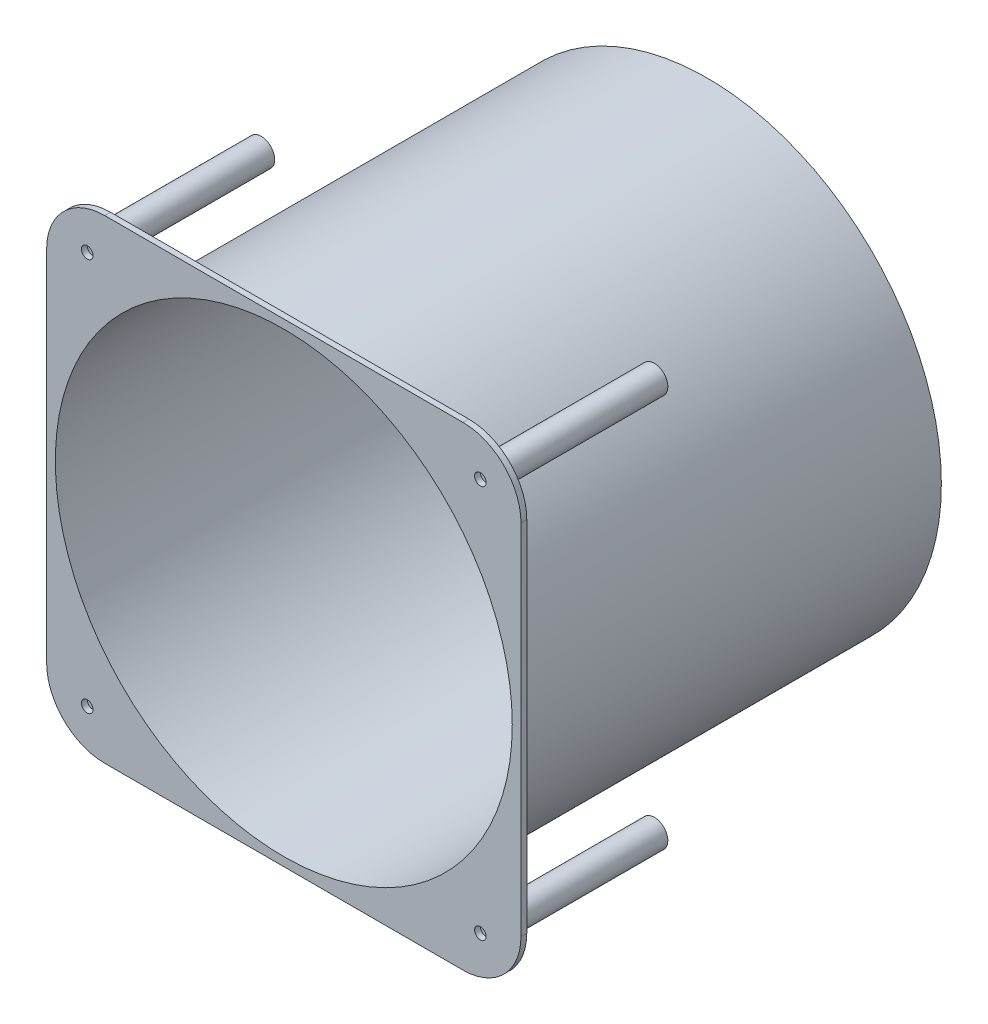
ISO-10303-21;
HEADER;
FILE_DESCRIPTION(('STEP AP214'),'2;1');
FILE_NAME('part.step','',(''),(''),'','','');
FILE_SCHEMA(('AUTOMOTIVE_DESIGN { 1 0 10303 214 1 1 1 1 }'));
ENDSEC;
DATA;
#1=APPLICATION_CONTEXT('core data for automotive mechanical design processes');
#2=APPLICATION_PROTOCOL_DEFINITION('international standard','automotive_design',2000,#1);
#3=PRODUCT_CONTEXT('',#1,'mechanical');
#4=PRODUCT('Part','Part','',(#3));
#5=PRODUCT_RELATED_PRODUCT_CATEGORY('part','',(#4));
#6=PRODUCT_DEFINITION_FORMATION('','',#4);
#7=PRODUCT_DEFINITION_CONTEXT('part definition',#1,'design');
#8=PRODUCT_DEFINITION('design','',#6,#7);
#9=PRODUCT_DEFINITION_SHAPE('','',#8);
#10=(LENGTH_UNIT() NAMED_UNIT(*) SI_UNIT(.MILLI.,.METRE.));
#11=(NAMED_UNIT(*) PLANE_ANGLE_UNIT() SI_UNIT($,.RADIAN.));
#12=(NAMED_UNIT(*) SI_UNIT($,.STERADIAN.) SOLID_ANGLE_UNIT());
#13=UNCERTAINTY_MEASURE_WITH_UNIT(LENGTH_MEASURE(1.E-05),#10,'distance_accuracy_value','');
#14=(GEOMETRIC_REPRESENTATION_CONTEXT(3) GLOBAL_UNCERTAINTY_ASSIGNED_CONTEXT((#13)) GLOBAL_UNIT_ASSIGNED_CONTEXT((#10,
#11,#12)) REPRESENTATION_CONTEXT('',''));
#15=CARTESIAN_POINT('',(0.,0.,0.));
#16=DIRECTION('',(0.,0.,1.));
#17=DIRECTION('',(1.,0.,0.));
#18=AXIS2_PLACEMENT_3D('',#15,#16,#17);
#19=CARTESIAN_POINT('',(0.,0.,-92.71));
#20=DIRECTION('',(0.,0.,1.));
#21=DIRECTION('',(1.,0.,0.));
#22=AXIS2_PLACEMENT_3D('',#19,#20,#21);
#23=CYLINDRICAL_SURFACE('',#22,51.308);
#24=CARTESIAN_POINT('',(0.,0.,-1.26999999999999));
#25=DIRECTION('',(0.,0.,-1.));
#26=DIRECTION('',(-1.,0.,0.));
#27=AXIS2_PLACEMENT_3D('',#24,#25,#26);
#28=CIRCLE('',#27,51.308);
#29=CARTESIAN_POINT('',(51.308,0.,-1.26999999999999));
#30=VERTEX_POINT('',#29);
#31=EDGE_CURVE('E130',#30,#30,#28,.F.);
#32=CARTESIAN_POINT('',(0.,0.,-92.71));
#33=DIRECTION('',(0.,0.,1.));
#34=DIRECTION('',(1.,0.,0.));
#35=AXIS2_PLACEMENT_3D('',#32,#33,#34);
#36=CIRCLE('',#35,51.308);
#37=CARTESIAN_POINT('',(51.308,0.,-92.71));
#38=VERTEX_POINT('',#37);
#39=EDGE_CURVE('E135',#38,#38,#36,.T.);
#40=CARTESIAN_POINT('',(51.308,0.,-1.26999999999999));
#41=CARTESIAN_POINT('',(51.308,0.,-2.22249999999999));
#42=CARTESIAN_POINT('',(51.308,0.,-3.17499999999999));
#43=CARTESIAN_POINT('',(51.308,0.,-5.07999999999999));
#44=CARTESIAN_POINT('',(51.308,0.,-6.03249999999999));
#45=CARTESIAN_POINT('',(51.308,0.,-7.93749999999999));
#46=CARTESIAN_POINT('',(51.308,0.,-8.89));
#47=CARTESIAN_POINT('',(51.308,0.,-10.795));
#48=CARTESIAN_POINT('',(51.308,0.,-11.7475));
#49=CARTESIAN_POINT('',(51.308,0.,-13.6525));
#50=CARTESIAN_POINT('',(51.308,0.,-14.605));
#51=CARTESIAN_POINT('',(51.308,0.,-16.51));
#52=CARTESIAN_POINT('',(51.308,0.,-17.4625));
#53=CARTESIAN_POINT('',(51.308,0.,-19.3675));
#54=CARTESIAN_POINT('',(51.308,0.,-20.32));
#55=CARTESIAN_POINT('',(51.308,0.,-22.225));
#56=CARTESIAN_POINT('',(51.308,0.,-23.1775));
#57=CARTESIAN_POINT('',(51.308,0.,-25.0825));
#58=CARTESIAN_POINT('',(51.308,0.,-26.035));
#59=CARTESIAN_POINT('',(51.308,0.,-27.94));
#60=CARTESIAN_POINT('',(51.308,0.,-28.8925));
#61=CARTESIAN_POINT('',(51.308,0.,-30.7975));
#62=CARTESIAN_POINT('',(51.308,0.,-31.75));
#63=CARTESIAN_POINT('',(51.308,0.,-33.655));
#64=CARTESIAN_POINT('',(51.308,0.,-34.6075));
#65=CARTESIAN_POINT('',(51.308,0.,-36.5125));
#66=CARTESIAN_POINT('',(51.308,0.,-37.465));
#67=CARTESIAN_POINT('',(51.308,0.,-39.37));
#68=CARTESIAN_POINT('',(51.308,0.,-40.3225));
#69=CARTESIAN_POINT('',(51.308,0.,-42.2275));
#70=CARTESIAN_POINT('',(51.308,0.,-43.18));
#71=CARTESIAN_POINT('',(51.308,0.,-45.085));
#72=CARTESIAN_POINT('',(51.308,0.,-46.0375));
#73=CARTESIAN_POINT('',(51.308,0.,-47.9425));
#74=CARTESIAN_POINT('',(51.308,0.,-48.895));
#75=CARTESIAN_POINT('',(51.308,0.,-50.8));
#76=CARTESIAN_POINT('',(51.308,0.,-51.7525));
#77=CARTESIAN_POINT('',(51.308,0.,-53.6575));
#78=CARTESIAN_POINT('',(51.308,0.,-54.61));
#79=CARTESIAN_POINT('',(51.308,0.,-56.515));
#80=CARTESIAN_POINT('',(51.308,0.,-57.4675));
#81=CARTESIAN_POINT('',(51.308,0.,-59.3725));
#82=CARTESIAN_POINT('',(51.308,0.,-60.325));
#83=CARTESIAN_POINT('',(51.308,0.,-62.23));
#84=CARTESIAN_POINT('',(51.308,0.,-63.1825));
#85=CARTESIAN_POINT('',(51.308,0.,-65.0875));
#86=CARTESIAN_POINT('',(51.308,0.,-66.04));
#87=CARTESIAN_POINT('',(51.308,0.,-67.945));
#88=CARTESIAN_POINT('',(51.308,0.,-68.8975));
#89=CARTESIAN_POINT('',(51.308,0.,-70.8025));
#90=CARTESIAN_POINT('',(51.308,0.,-71.755));
#91=CARTESIAN_POINT('',(51.308,0.,-73.66));
#92=CARTESIAN_POINT('',(51.308,0.,-74.6125));
#93=CARTESIAN_POINT('',(51.308,0.,-76.5175));
#94=CARTESIAN_POINT('',(51.308,0.,-77.47));
#95=CARTESIAN_POINT('',(51.308,0.,-79.375));
#96=CARTESIAN_POINT('',(51.308,0.,-80.3275));
#97=CARTESIAN_POINT('',(51.308,0.,-82.2325));
#98=CARTESIAN_POINT('',(51.308,0.,-83.185));
#99=CARTESIAN_POINT('',(51.308,0.,-85.09));
#100=CARTESIAN_POINT('',(51.308,0.,-86.0425));
#101=CARTESIAN_POINT('',(51.308,0.,-87.9475));
#102=CARTESIAN_POINT('',(51.308,0.,-88.9));
#103=CARTESIAN_POINT('',(51.308,0.,-90.805));
#104=CARTESIAN_POINT('',(51.308,0.,-91.7575));
#105=CARTESIAN_POINT('',(51.308,0.,-92.71));
#106=B_SPLINE_CURVE_WITH_KNOTS('',3,(#40,#41,#42,#43,#44,#45,#46,#47,#48,#49,#50,#51,#52,#53,
#54,#55,#56,#57,#58,#59,#60,#61,#62,#63,#64,#65,#66,#67,#68,#69,#70,#71,#72,#73,#74,#75,#76,#77,
#78,#79,#80,#81,#82,#83,#84,#85,#86,#87,#88,#89,#90,#91,#92,#93,#94,#95,#96,#97,#98,#99,#100,
#101,#102,#103,#104,#105),.UNSPECIFIED.,.F.,.F.,(4,2,2,2,2,2,2,2,2,2,2,2,2,2,2,2,2,2,2,2,2,2,2,
2,2,2,2,2,2,2,2,2,4),(0.,2.8575,5.715,8.57250000000001,11.43,14.2875,17.145,20.0025,22.86,
25.7175,28.575,31.4325,34.29,37.1475,40.005,42.8625,45.72,48.5775,51.435,54.2925,57.15,60.0075,
62.865,65.7225,68.58,71.4375,74.295,77.1525,80.01,82.8675,85.725,88.5825,91.44),.UNSPECIFIED.);
#107=EDGE_CURVE('BSEAM38',#30,#38,#106,.T.);
#108=ORIENTED_EDGE('',*,*,#31,.F.);
#109=ORIENTED_EDGE('',*,*,#39,.T.);
#110=ORIENTED_EDGE('',*,*,#107,.T.);
#111=ORIENTED_EDGE('',*,*,#107,.F.);
#112=EDGE_LOOP('',(#108,#110,#109,#111));
#113=FACE_BOUND('',#112,.T.);
#114=ADVANCED_FACE('F38',(#113),#23,.T.);
#115=CARTESIAN_POINT('',(0.,0.,-92.71));
#116=DIRECTION('',(0.,0.,1.));
#117=DIRECTION('',(1.,0.,0.));
#118=AXIS2_PLACEMENT_3D('',#115,#116,#117);
#119=PLANE('',#118);
#120=CARTESIAN_POINT('',(0.,0.,-92.71));
#121=DIRECTION('',(0.,0.,1.));
#122=DIRECTION('',(1.,0.,0.));
#123=AXIS2_PLACEMENT_3D('',#120,#121,#122);
#124=CIRCLE('',#123,50.038);
#125=CARTESIAN_POINT('',(50.038,0.,-92.71));
#126=VERTEX_POINT('',#125);
#127=EDGE_CURVE('E247',#126,#126,#124,.T.);
#128=ORIENTED_EDGE('',*,*,#127,.T.);
#129=EDGE_LOOP('',(#128));
#130=FACE_BOUND('',#129,.T.);
#131=ORIENTED_EDGE('',*,*,#39,.F.);
#132=EDGE_LOOP('',(#131));
#133=FACE_BOUND('',#132,.T.);
#134=ADVANCED_FACE('F179',(#130,#133),#119,.F.);
#135=CARTESIAN_POINT('',(51.943,-51.943,-1.27));
#136=DIRECTION('',(1.,0.,0.));
#137=DIRECTION('',(0.,0.,-1.));
#138=AXIS2_PLACEMENT_3D('',#135,#136,#137);
#139=PLANE('',#138);
#140=DIRECTION('',(0.,1.,0.));
#141=VECTOR('',#140,1.);
#142=CARTESIAN_POINT('',(51.943,-51.943,0.));
#143=LINE('',#142,#141);
#144=CARTESIAN_POINT('',(51.943,-39.243,0.));
#145=VERTEX_POINT('',#144);
#146=CARTESIAN_POINT('',(51.943,39.243,0.));
#147=VERTEX_POINT('',#146);
#148=EDGE_CURVE('E168',#145,#147,#143,.T.);
#149=ORIENTED_EDGE('',*,*,#148,.F.);
#150=DIRECTION('',(0.,0.,1.));
#151=VECTOR('',#150,1.);
#152=CARTESIAN_POINT('',(51.943,-39.243,-1.27));
#153=LINE('',#152,#151);
#154=CARTESIAN_POINT('',(51.943,-39.243,-1.27));
#155=VERTEX_POINT('',#154);
#156=EDGE_CURVE('E145',#145,#155,#153,.F.);
#157=ORIENTED_EDGE('',*,*,#156,.T.);
#158=DIRECTION('',(0.,1.,0.));
#159=VECTOR('',#158,1.);
#160=CARTESIAN_POINT('',(51.943,-51.943,-1.27));
#161=LINE('',#160,#159);
#162=CARTESIAN_POINT('',(51.943,39.243,-1.27));
#163=VERTEX_POINT('',#162);
#164=EDGE_CURVE('E125',#155,#163,#161,.T.);
#165=ORIENTED_EDGE('',*,*,#164,.T.);
#166=DIRECTION('',(0.,0.,1.));
#167=VECTOR('',#166,1.);
#168=CARTESIAN_POINT('',(51.943,39.243,-1.27));
#169=LINE('',#168,#167);
#170=EDGE_CURVE('E142',#163,#147,#169,.T.);
#171=ORIENTED_EDGE('',*,*,#170,.T.);
#172=EDGE_LOOP('',(#149,#157,#165,#171));
#173=FACE_BOUND('',#172,.T.);
#174=ADVANCED_FACE('F181',(#173),#139,.T.);
#175=CARTESIAN_POINT('',(-51.943,-51.943,-1.27));
#176=DIRECTION('',(0.,-1.,0.));
#177=DIRECTION('',(0.,0.,-1.));
#178=AXIS2_PLACEMENT_3D('',#175,#176,#177);
#179=PLANE('',#178);
#180=DIRECTION('',(1.,0.,0.));
#181=VECTOR('',#180,1.);
#182=CARTESIAN_POINT('',(-51.943,-51.943,-1.27));
#183=LINE('',#182,#181);
#184=CARTESIAN_POINT('',(-39.243,-51.943,-1.27));
#185=VERTEX_POINT('',#184);
#186=CARTESIAN_POINT('',(39.243,-51.943,-1.27));
#187=VERTEX_POINT('',#186);
#188=EDGE_CURVE('E161',#185,#187,#183,.T.);
#189=ORIENTED_EDGE('',*,*,#188,.T.);
#190=DIRECTION('',(0.,0.,1.));
#191=VECTOR('',#190,1.);
#192=CARTESIAN_POINT('',(39.243,-51.943,-1.27));
#193=LINE('',#192,#191);
#194=CARTESIAN_POINT('',(39.243,-51.943,0.));
#195=VERTEX_POINT('',#194);
#196=EDGE_CURVE('E124',#187,#195,#193,.T.);
#197=ORIENTED_EDGE('',*,*,#196,.T.);
#198=DIRECTION('',(1.,0.,0.));
#199=VECTOR('',#198,1.);
#200=CARTESIAN_POINT('',(-51.943,-51.943,0.));
#201=LINE('',#200,#199);
#202=CARTESIAN_POINT('',(-39.243,-51.943,0.));
#203=VERTEX_POINT('',#202);
#204=EDGE_CURVE('E107',#203,#195,#201,.T.);
#205=ORIENTED_EDGE('',*,*,#204,.F.);
#206=DIRECTION('',(0.,0.,1.));
#207=VECTOR('',#206,1.);
#208=CARTESIAN_POINT('',(-39.243,-51.943,-1.27));
#209=LINE('',#208,#207);
#210=EDGE_CURVE('E121',#203,#185,#209,.F.);
#211=ORIENTED_EDGE('',*,*,#210,.T.);
#212=EDGE_LOOP('',(#189,#197,#205,#211));
#213=FACE_BOUND('',#212,.T.);
#214=ADVANCED_FACE('F120',(#213),#179,.T.);
#215=CARTESIAN_POINT('',(-51.943,-51.943,-1.27));
#216=DIRECTION('',(-1.,0.,0.));
#217=DIRECTION('',(0.,0.,1.));
#218=AXIS2_PLACEMENT_3D('',#215,#216,#217);
#219=PLANE('',#218);
#220=DIRECTION('',(0.,-1.,0.));
#221=VECTOR('',#220,1.);
#222=CARTESIAN_POINT('',(-51.943,-51.943,-1.27));
#223=LINE('',#222,#221);
#224=CARTESIAN_POINT('',(-51.943,39.243,-1.27));
#225=VERTEX_POINT('',#224);
#226=CARTESIAN_POINT('',(-51.943,-39.243,-1.27));
#227=VERTEX_POINT('',#226);
#228=EDGE_CURVE('E160',#225,#227,#223,.T.);
#229=ORIENTED_EDGE('',*,*,#228,.T.);
#230=DIRECTION('',(0.,0.,1.));
#231=VECTOR('',#230,1.);
#232=CARTESIAN_POINT('',(-51.943,-39.243,-1.27));
#233=LINE('',#232,#231);
#234=CARTESIAN_POINT('',(-51.943,-39.243,0.));
#235=VERTEX_POINT('',#234);
#236=EDGE_CURVE('E155',#227,#235,#233,.T.);
#237=ORIENTED_EDGE('',*,*,#236,.T.);
#238=DIRECTION('',(0.,-1.,0.));
#239=VECTOR('',#238,1.);
#240=CARTESIAN_POINT('',(-51.943,-51.943,0.));
#241=LINE('',#240,#239);
#242=CARTESIAN_POINT('',(-51.943,39.243,0.));
#243=VERTEX_POINT('',#242);
#244=EDGE_CURVE('E109',#243,#235,#241,.T.);
#245=ORIENTED_EDGE('',*,*,#244,.F.);
#246=DIRECTION('',(0.,0.,1.));
#247=VECTOR('',#246,1.);
#248=CARTESIAN_POINT('',(-51.943,39.243,-1.27));
#249=LINE('',#248,#247);
#250=EDGE_CURVE('E153',#243,#225,#249,.F.);
#251=ORIENTED_EDGE('',*,*,#250,.T.);
#252=EDGE_LOOP('',(#229,#237,#245,#251));
#253=FACE_BOUND('',#252,.T.);
#254=ADVANCED_FACE('F158',(#253),#219,.T.);
#255=CARTESIAN_POINT('',(-51.943,51.943,-1.27));
#256=DIRECTION('',(0.,1.,0.));
#257=DIRECTION('',(0.,0.,1.));
#258=AXIS2_PLACEMENT_3D('',#255,#256,#257);
#259=PLANE('',#258);
#260=DIRECTION('',(-1.,0.,0.));
#261=VECTOR('',#260,1.);
#262=CARTESIAN_POINT('',(-51.943,51.943,-1.27));
#263=LINE('',#262,#261);
#264=CARTESIAN_POINT('',(39.243,51.943,-1.27));
#265=VERTEX_POINT('',#264);
#266=CARTESIAN_POINT('',(-39.243,51.943,-1.27));
#267=VERTEX_POINT('',#266);
#268=EDGE_CURVE('E162',#265,#267,#263,.T.);
#269=ORIENTED_EDGE('',*,*,#268,.T.);
#270=DIRECTION('',(0.,0.,1.));
#271=VECTOR('',#270,1.);
#272=CARTESIAN_POINT('',(-39.243,51.943,-1.27));
#273=LINE('',#272,#271);
#274=CARTESIAN_POINT('',(-39.243,51.943,0.));
#275=VERTEX_POINT('',#274);
#276=EDGE_CURVE('E11',#267,#275,#273,.T.);
#277=ORIENTED_EDGE('',*,*,#276,.T.);
#278=DIRECTION('',(-1.,0.,0.));
#279=VECTOR('',#278,1.);
#280=CARTESIAN_POINT('',(-51.943,51.943,0.));
#281=LINE('',#280,#279);
#282=CARTESIAN_POINT('',(39.243,51.943,0.));
#283=VERTEX_POINT('',#282);
#284=EDGE_CURVE('E171',#283,#275,#281,.T.);
#285=ORIENTED_EDGE('',*,*,#284,.F.);
#286=DIRECTION('',(0.,0.,1.));
#287=VECTOR('',#286,1.);
#288=CARTESIAN_POINT('',(39.243,51.943,-1.27));
#289=LINE('',#288,#287);
#290=EDGE_CURVE('E46',#283,#265,#289,.F.);
#291=ORIENTED_EDGE('',*,*,#290,.T.);
#292=EDGE_LOOP('',(#269,#277,#285,#291));
#293=FACE_BOUND('',#292,.T.);
#294=ADVANCED_FACE('F214',(#293),#259,.T.);
#295=CARTESIAN_POINT('',(0.,0.,-1.27));
#296=DIRECTION('',(0.,0.,-1.));
#297=DIRECTION('',(-1.,0.,0.));
#298=AXIS2_PLACEMENT_3D('',#295,#296,#297);
#299=PLANE('',#298);
#300=CARTESIAN_POINT('',(43.053,-43.053,-1.27));
#301=DIRECTION('',(0.,0.,-1.));
#302=DIRECTION('',(-1.,0.,0.));
#303=AXIS2_PLACEMENT_3D('',#300,#301,#302);
#304=CIRCLE('',#303,2.9591);
#305=CARTESIAN_POINT('',(40.0939,-43.053,-1.27));
#306=VERTEX_POINT('',#305);
#307=EDGE_CURVE('E270',#306,#306,#304,.T.);
#308=ORIENTED_EDGE('',*,*,#307,.F.);
#309=EDGE_LOOP('',(#308));
#310=FACE_BOUND('',#309,.T.);
#311=CARTESIAN_POINT('',(-43.053,-43.053,-1.27));
#312=DIRECTION('',(0.,0.,-1.));
#313=DIRECTION('',(-1.,0.,0.));
#314=AXIS2_PLACEMENT_3D('',#311,#312,#313);
#315=CIRCLE('',#314,2.9591);
#316=CARTESIAN_POINT('',(-46.0121,-43.053,-1.27));
#317=VERTEX_POINT('',#316);
#318=EDGE_CURVE('E264',#317,#317,#315,.T.);
#319=ORIENTED_EDGE('',*,*,#318,.F.);
#320=EDGE_LOOP('',(#319));
#321=FACE_BOUND('',#320,.T.);
#322=CARTESIAN_POINT('',(-43.053,43.053,-1.27));
#323=DIRECTION('',(0.,0.,-1.));
#324=DIRECTION('',(-1.,0.,0.));
#325=AXIS2_PLACEMENT_3D('',#322,#323,#324);
#326=CIRCLE('',#325,2.9591);
#327=CARTESIAN_POINT('',(-46.0121,43.053,-1.27));
#328=VERTEX_POINT('',#327);
#329=EDGE_CURVE('E258',#328,#328,#326,.T.);
#330=ORIENTED_EDGE('',*,*,#329,.F.);
#331=EDGE_LOOP('',(#330));
#332=FACE_BOUND('',#331,.T.);
#333=CARTESIAN_POINT('',(43.053,43.053,-1.27));
#334=DIRECTION('',(0.,0.,-1.));
#335=DIRECTION('',(-1.,0.,0.));
#336=AXIS2_PLACEMENT_3D('',#333,#334,#335);
#337=CIRCLE('',#336,2.9591);
#338=CARTESIAN_POINT('',(40.0939,43.053,-1.27));
#339=VERTEX_POINT('',#338);
#340=EDGE_CURVE('E252',#339,#339,#337,.T.);
#341=ORIENTED_EDGE('',*,*,#340,.F.);
#342=EDGE_LOOP('',(#341));
#343=FACE_BOUND('',#342,.T.);
#344=ORIENTED_EDGE('',*,*,#31,.T.);
#345=EDGE_LOOP('',(#344));
#346=FACE_BOUND('',#345,.T.);
#347=ORIENTED_EDGE('',*,*,#164,.F.);
#348=CARTESIAN_POINT('',(39.243,-39.243,-1.27));
#349=DIRECTION('',(0.,0.,-1.));
#350=DIRECTION('',(-1.,0.,0.));
#351=AXIS2_PLACEMENT_3D('',#348,#349,#350);
#352=CIRCLE('',#351,12.7);
#353=EDGE_CURVE('E151',#155,#187,#352,.T.);
#354=ORIENTED_EDGE('',*,*,#353,.T.);
#355=ORIENTED_EDGE('',*,*,#188,.F.);
#356=CARTESIAN_POINT('',(-39.243,-39.243,-1.27));
#357=DIRECTION('',(0.,0.,-1.));
#358=DIRECTION('',(-1.,0.,0.));
#359=AXIS2_PLACEMENT_3D('',#356,#357,#358);
#360=CIRCLE('',#359,12.7);
#361=EDGE_CURVE('E129',#185,#227,#360,.T.);
#362=ORIENTED_EDGE('',*,*,#361,.T.);
#363=ORIENTED_EDGE('',*,*,#228,.F.);
#364=CARTESIAN_POINT('',(-39.243,39.243,-1.27));
#365=DIRECTION('',(0.,0.,-1.));
#366=DIRECTION('',(-1.,0.,0.));
#367=AXIS2_PLACEMENT_3D('',#364,#365,#366);
#368=CIRCLE('',#367,12.7);
#369=EDGE_CURVE('E53',#225,#267,#368,.T.);
#370=ORIENTED_EDGE('',*,*,#369,.T.);
#371=ORIENTED_EDGE('',*,*,#268,.F.);
#372=CARTESIAN_POINT('',(39.243,39.243,-1.27));
#373=DIRECTION('',(0.,0.,-1.));
#374=DIRECTION('',(-1.,0.,0.));
#375=AXIS2_PLACEMENT_3D('',#372,#373,#374);
#376=CIRCLE('',#375,12.7);
#377=EDGE_CURVE('E147',#265,#163,#376,.T.);
#378=ORIENTED_EDGE('',*,*,#377,.T.);
#379=EDGE_LOOP('',(#347,#354,#355,#362,#363,#370,#371,#378));
#380=FACE_BOUND('',#379,.T.);
#381=ADVANCED_FACE('F285',(#310,#321,#332,#343,#346,#380),#299,.T.);
#382=CARTESIAN_POINT('',(43.053,43.053,-1.27));
#383=DIRECTION('',(0.,0.,1.));
#384=DIRECTION('',(1.,0.,0.));
#385=AXIS2_PLACEMENT_3D('',#382,#383,#384);
#386=CYLINDRICAL_SURFACE('',#385,1.27);
#387=CARTESIAN_POINT('',(43.053,43.053,-1.27));
#388=DIRECTION('',(0.,0.,1.));
#389=DIRECTION('',(1.,0.,0.));
#390=AXIS2_PLACEMENT_3D('',#387,#388,#389);
#391=CIRCLE('',#390,1.27);
#392=CARTESIAN_POINT('',(44.323,43.053,-1.27));
#393=VERTEX_POINT('',#392);
#394=EDGE_CURVE('E172',#393,#393,#391,.T.);
#395=ORIENTED_EDGE('',*,*,#394,.F.);
#396=EDGE_LOOP('',(#395));
#397=FACE_BOUND('',#396,.T.);
#398=CARTESIAN_POINT('',(43.053,43.053,0.));
#399=DIRECTION('',(0.,0.,1.));
#400=DIRECTION('',(1.,0.,0.));
#401=AXIS2_PLACEMENT_3D('',#398,#399,#400);
#402=CIRCLE('',#401,1.27);
#403=CARTESIAN_POINT('',(44.323,43.053,0.));
#404=VERTEX_POINT('',#403);
#405=EDGE_CURVE('E223',#404,#404,#402,.T.);
#406=ORIENTED_EDGE('',*,*,#405,.T.);
#407=EDGE_LOOP('',(#406));
#408=FACE_BOUND('',#407,.T.);
#409=ADVANCED_FACE('F288',(#397,#408),#386,.F.);
#410=CARTESIAN_POINT('',(-43.053,43.053,-1.27));
#411=DIRECTION('',(0.,0.,1.));
#412=DIRECTION('',(1.,0.,0.));
#413=AXIS2_PLACEMENT_3D('',#410,#411,#412);
#414=CYLINDRICAL_SURFACE('',#413,1.27);
#415=CARTESIAN_POINT('',(-43.053,43.053,-1.27));
#416=DIRECTION('',(0.,0.,1.));
#417=DIRECTION('',(1.,0.,0.));
#418=AXIS2_PLACEMENT_3D('',#415,#416,#417);
#419=CIRCLE('',#418,1.27);
#420=CARTESIAN_POINT('',(-41.783,43.053,-1.27));
#421=VERTEX_POINT('',#420);
#422=EDGE_CURVE('E226',#421,#421,#419,.T.);
#423=ORIENTED_EDGE('',*,*,#422,.F.);
#424=EDGE_LOOP('',(#423));
#425=FACE_BOUND('',#424,.T.);
#426=CARTESIAN_POINT('',(-43.053,43.053,0.));
#427=DIRECTION('',(0.,0.,1.));
#428=DIRECTION('',(1.,0.,0.));
#429=AXIS2_PLACEMENT_3D('',#426,#427,#428);
#430=CIRCLE('',#429,1.27);
#431=CARTESIAN_POINT('',(-41.783,43.053,0.));
#432=VERTEX_POINT('',#431);
#433=EDGE_CURVE('E229',#432,#432,#430,.T.);
#434=ORIENTED_EDGE('',*,*,#433,.T.);
#435=EDGE_LOOP('',(#434));
#436=FACE_BOUND('',#435,.T.);
#437=ADVANCED_FACE('F323',(#425,#436),#414,.F.);
#438=CARTESIAN_POINT('',(43.053,-43.053,-1.27));
#439=DIRECTION('',(0.,0.,1.));
#440=DIRECTION('',(1.,0.,0.));
#441=AXIS2_PLACEMENT_3D('',#438,#439,#440);
#442=CYLINDRICAL_SURFACE('',#441,1.27);
#443=CARTESIAN_POINT('',(43.053,-43.053,-1.27));
#444=DIRECTION('',(0.,0.,1.));
#445=DIRECTION('',(1.,0.,0.));
#446=AXIS2_PLACEMENT_3D('',#443,#444,#445);
#447=CIRCLE('',#446,1.27);
#448=CARTESIAN_POINT('',(44.323,-43.053,-1.27));
#449=VERTEX_POINT('',#448);
#450=EDGE_CURVE('E232',#449,#449,#447,.T.);
#451=ORIENTED_EDGE('',*,*,#450,.F.);
#452=EDGE_LOOP('',(#451));
#453=FACE_BOUND('',#452,.T.);
#454=CARTESIAN_POINT('',(43.053,-43.053,0.));
#455=DIRECTION('',(0.,0.,1.));
#456=DIRECTION('',(1.,0.,0.));
#457=AXIS2_PLACEMENT_3D('',#454,#455,#456);
#458=CIRCLE('',#457,1.27);
#459=CARTESIAN_POINT('',(44.323,-43.053,0.));
#460=VERTEX_POINT('',#459);
#461=EDGE_CURVE('E235',#460,#460,#458,.T.);
#462=ORIENTED_EDGE('',*,*,#461,.T.);
#463=EDGE_LOOP('',(#462));
#464=FACE_BOUND('',#463,.T.);
#465=ADVANCED_FACE('F319',(#453,#464),#442,.F.);
#466=CARTESIAN_POINT('',(-43.053,-43.053,-1.27));
#467=DIRECTION('',(0.,0.,1.));
#468=DIRECTION('',(1.,0.,0.));
#469=AXIS2_PLACEMENT_3D('',#466,#467,#468);
#470=CYLINDRICAL_SURFACE('',#469,1.27);
#471=CARTESIAN_POINT('',(-43.053,-43.053,-1.27));
#472=DIRECTION('',(0.,0.,1.));
#473=DIRECTION('',(1.,0.,0.));
#474=AXIS2_PLACEMENT_3D('',#471,#472,#473);
#475=CIRCLE('',#474,1.27);
#476=CARTESIAN_POINT('',(-41.783,-43.053,-1.27));
#477=VERTEX_POINT('',#476);
#478=EDGE_CURVE('E238',#477,#477,#475,.T.);
#479=ORIENTED_EDGE('',*,*,#478,.F.);
#480=EDGE_LOOP('',(#479));
#481=FACE_BOUND('',#480,.T.);
#482=CARTESIAN_POINT('',(-43.053,-43.053,0.));
#483=DIRECTION('',(0.,0.,1.));
#484=DIRECTION('',(1.,0.,0.));
#485=AXIS2_PLACEMENT_3D('',#482,#483,#484);
#486=CIRCLE('',#485,1.27);
#487=CARTESIAN_POINT('',(-41.783,-43.053,0.));
#488=VERTEX_POINT('',#487);
#489=EDGE_CURVE('E241',#488,#488,#486,.T.);
#490=ORIENTED_EDGE('',*,*,#489,.T.);
#491=EDGE_LOOP('',(#490));
#492=FACE_BOUND('',#491,.T.);
#493=ADVANCED_FACE('F197',(#481,#492),#470,.F.);
#494=CARTESIAN_POINT('',(0.,0.,0.));
#495=DIRECTION('',(0.,0.,1.));
#496=DIRECTION('',(1.,0.,0.));
#497=AXIS2_PLACEMENT_3D('',#494,#495,#496);
#498=PLANE('',#497);
#499=CARTESIAN_POINT('',(0.,0.,0.));
#500=DIRECTION('',(0.,0.,-1.));
#501=DIRECTION('',(-1.,0.,0.));
#502=AXIS2_PLACEMENT_3D('',#499,#500,#501);
#503=CIRCLE('',#502,50.038);
#504=CARTESIAN_POINT('',(50.038,0.,0.));
#505=VERTEX_POINT('',#504);
#506=EDGE_CURVE('E244',#505,#505,#503,.F.);
#507=ORIENTED_EDGE('',*,*,#506,.F.);
#508=EDGE_LOOP('',(#507));
#509=FACE_BOUND('',#508,.T.);
#510=ORIENTED_EDGE('',*,*,#489,.F.);
#511=EDGE_LOOP('',(#510));
#512=FACE_BOUND('',#511,.T.);
#513=ORIENTED_EDGE('',*,*,#461,.F.);
#514=EDGE_LOOP('',(#513));
#515=FACE_BOUND('',#514,.T.);
#516=ORIENTED_EDGE('',*,*,#433,.F.);
#517=EDGE_LOOP('',(#516));
#518=FACE_BOUND('',#517,.T.);
#519=ORIENTED_EDGE('',*,*,#405,.F.);
#520=EDGE_LOOP('',(#519));
#521=FACE_BOUND('',#520,.T.);
#522=ORIENTED_EDGE('',*,*,#204,.T.);
#523=CARTESIAN_POINT('',(39.243,-39.243,0.));
#524=DIRECTION('',(0.,0.,1.));
#525=DIRECTION('',(1.,0.,0.));
#526=AXIS2_PLACEMENT_3D('',#523,#524,#525);
#527=CIRCLE('',#526,12.7);
#528=EDGE_CURVE('E114',#195,#145,#527,.T.);
#529=ORIENTED_EDGE('',*,*,#528,.T.);
#530=ORIENTED_EDGE('',*,*,#148,.T.);
#531=CARTESIAN_POINT('',(39.243,39.243,0.));
#532=DIRECTION('',(0.,0.,1.));
#533=DIRECTION('',(1.,0.,0.));
#534=AXIS2_PLACEMENT_3D('',#531,#532,#533);
#535=CIRCLE('',#534,12.7);
#536=EDGE_CURVE('E132',#147,#283,#535,.T.);
#537=ORIENTED_EDGE('',*,*,#536,.T.);
#538=ORIENTED_EDGE('',*,*,#284,.T.);
#539=CARTESIAN_POINT('',(-39.243,39.243,0.));
#540=DIRECTION('',(0.,0.,1.));
#541=DIRECTION('',(1.,0.,0.));
#542=AXIS2_PLACEMENT_3D('',#539,#540,#541);
#543=CIRCLE('',#542,12.7);
#544=EDGE_CURVE('E115',#275,#243,#543,.T.);
#545=ORIENTED_EDGE('',*,*,#544,.T.);
#546=ORIENTED_EDGE('',*,*,#244,.T.);
#547=CARTESIAN_POINT('',(-39.243,-39.243,0.));
#548=DIRECTION('',(0.,0.,1.));
#549=DIRECTION('',(1.,0.,0.));
#550=AXIS2_PLACEMENT_3D('',#547,#548,#549);
#551=CIRCLE('',#550,12.7);
#552=EDGE_CURVE('E104',#235,#203,#551,.T.);
#553=ORIENTED_EDGE('',*,*,#552,.T.);
#554=EDGE_LOOP('',(#522,#529,#530,#537,#538,#545,#546,#553));
#555=FACE_BOUND('',#554,.T.);
#556=ADVANCED_FACE('F106',(#509,#512,#515,#518,#521,#555),#498,.T.);
#557=CARTESIAN_POINT('',(0.,0.,-92.71));
#558=DIRECTION('',(0.,0.,1.));
#559=DIRECTION('',(1.,0.,0.));
#560=AXIS2_PLACEMENT_3D('',#557,#558,#559);
#561=CYLINDRICAL_SURFACE('',#560,50.038);
#562=CARTESIAN_POINT('',(50.038,0.,0.));
#563=CARTESIAN_POINT('',(50.038,0.,-0.965729166666664));
#564=CARTESIAN_POINT('',(50.038,0.,-1.93145833333333));
#565=CARTESIAN_POINT('',(50.038,0.,-3.86291666666667));
#566=CARTESIAN_POINT('',(50.038,0.,-4.82864583333333));
#567=CARTESIAN_POINT('',(50.038,0.,-6.76010416666667));
#568=CARTESIAN_POINT('',(50.038,0.,-7.72583333333333));
#569=CARTESIAN_POINT('',(50.038,0.,-9.65729166666667));
#570=CARTESIAN_POINT('',(50.038,0.,-10.6230208333333));
#571=CARTESIAN_POINT('',(50.038,0.,-12.5544791666667));
#572=CARTESIAN_POINT('',(50.038,0.,-13.5202083333333));
#573=CARTESIAN_POINT('',(50.038,0.,-15.4516666666667));
#574=CARTESIAN_POINT('',(50.038,0.,-16.4173958333333));
#575=CARTESIAN_POINT('',(50.038,0.,-18.3488541666667));
#576=CARTESIAN_POINT('',(50.038,0.,-19.3145833333333));
#577=CARTESIAN_POINT('',(50.038,0.,-21.2460416666667));
#578=CARTESIAN_POINT('',(50.038,0.,-22.2117708333333));
#579=CARTESIAN_POINT('',(50.038,0.,-24.1432291666667));
#580=CARTESIAN_POINT('',(50.038,0.,-25.1089583333333));
#581=CARTESIAN_POINT('',(50.038,0.,-27.0404166666667));
#582=CARTESIAN_POINT('',(50.038,0.,-28.0061458333333));
#583=CARTESIAN_POINT('',(50.038,0.,-29.9376041666667));
#584=CARTESIAN_POINT('',(50.038,0.,-30.9033333333333));
#585=CARTESIAN_POINT('',(50.038,0.,-32.8347916666667));
#586=CARTESIAN_POINT('',(50.038,0.,-33.8005208333333));
#587=CARTESIAN_POINT('',(50.038,0.,-35.7319791666667));
#588=CARTESIAN_POINT('',(50.038,0.,-36.6977083333333));
#589=CARTESIAN_POINT('',(50.038,0.,-38.6291666666667));
#590=CARTESIAN_POINT('',(50.038,0.,-39.5948958333333));
#591=CARTESIAN_POINT('',(50.038,0.,-41.5263541666667));
#592=CARTESIAN_POINT('',(50.038,0.,-42.4920833333333));
#593=CARTESIAN_POINT('',(50.038,0.,-44.4235416666667));
#594=CARTESIAN_POINT('',(50.038,0.,-45.3892708333333));
#595=CARTESIAN_POINT('',(50.038,0.,-47.3207291666667));
#596=CARTESIAN_POINT('',(50.038,0.,-48.2864583333333));
#597=CARTESIAN_POINT('',(50.038,0.,-50.2179166666667));
#598=CARTESIAN_POINT('',(50.038,0.,-51.1836458333333));
#599=CARTESIAN_POINT('',(50.038,0.,-53.1151041666667));
#600=CARTESIAN_POINT('',(50.038,0.,-54.0808333333333));
#601=CARTESIAN_POINT('',(50.038,0.,-56.0122916666667));
#602=CARTESIAN_POINT('',(50.038,0.,-56.9780208333333));
#603=CARTESIAN_POINT('',(50.038,0.,-58.9094791666667));
#604=CARTESIAN_POINT('',(50.038,0.,-59.8752083333333));
#605=CARTESIAN_POINT('',(50.038,0.,-61.8066666666667));
#606=CARTESIAN_POINT('',(50.038,0.,-62.7723958333333));
#607=CARTESIAN_POINT('',(50.038,0.,-64.7038541666667));
#608=CARTESIAN_POINT('',(50.038,0.,-65.6695833333333));
#609=CARTESIAN_POINT('',(50.038,0.,-67.6010416666667));
#610=CARTESIAN_POINT('',(50.038,0.,-68.5667708333333));
#611=CARTESIAN_POINT('',(50.038,0.,-70.4982291666667));
#612=CARTESIAN_POINT('',(50.038,0.,-71.4639583333333));
#613=CARTESIAN_POINT('',(50.038,0.,-73.3954166666667));
#614=CARTESIAN_POINT('',(50.038,0.,-74.3611458333333));
#615=CARTESIAN_POINT('',(50.038,0.,-76.2926041666667));
#616=CARTESIAN_POINT('',(50.038,0.,-77.2583333333333));
#617=CARTESIAN_POINT('',(50.038,0.,-79.1897916666667));
#618=CARTESIAN_POINT('',(50.038,0.,-80.1555208333333));
#619=CARTESIAN_POINT('',(50.038,0.,-82.0869791666667));
#620=CARTESIAN_POINT('',(50.038,0.,-83.0527083333333));
#621=CARTESIAN_POINT('',(50.038,0.,-84.9841666666667));
#622=CARTESIAN_POINT('',(50.038,0.,-85.9498958333333));
#623=CARTESIAN_POINT('',(50.038,0.,-87.8813541666667));
#624=CARTESIAN_POINT('',(50.038,0.,-88.8470833333333));
#625=CARTESIAN_POINT('',(50.038,0.,-90.7785416666667));
#626=CARTESIAN_POINT('',(50.038,0.,-91.7442708333333));
#627=CARTESIAN_POINT('',(50.038,0.,-92.71));
#628=B_SPLINE_CURVE_WITH_KNOTS('',3,(#562,#563,#564,#565,#566,#567,#568,#569,#570,#571,#572,
#573,#574,#575,#576,#577,#578,#579,#580,#581,#582,#583,#584,#585,#586,#587,#588,#589,#590,#591,
#592,#593,#594,#595,#596,#597,#598,#599,#600,#601,#602,#603,#604,#605,#606,#607,#608,#609,#610,
#611,#612,#613,#614,#615,#616,#617,#618,#619,#620,#621,#622,#623,#624,#625,#626,#627),
.UNSPECIFIED.,.F.,.F.,(4,2,2,2,2,2,2,2,2,2,2,2,2,2,2,2,2,2,2,2,2,2,2,2,2,2,2,2,2,2,2,2,4),(0.,
2.8971875,5.794375,8.6915625,11.58875,14.4859375,17.383125,20.2803125,23.1775,26.0746875,
28.971875,31.8690625,34.76625,37.6634375,40.560625,43.4578125,46.355,49.2521875,52.149375,
55.0465625,57.94375,60.8409375,63.738125,66.6353125,69.5325,72.4296875,75.326875,78.2240625,
81.12125,84.0184375,86.915625,89.8128125,92.71),.UNSPECIFIED.);
#629=EDGE_CURVE('BSEAM196',#505,#126,#628,.T.);
#630=ORIENTED_EDGE('',*,*,#506,.T.);
#631=ORIENTED_EDGE('',*,*,#127,.F.);
#632=ORIENTED_EDGE('',*,*,#629,.T.);
#633=ORIENTED_EDGE('',*,*,#629,.F.);
#634=EDGE_LOOP('',(#630,#632,#631,#633));
#635=FACE_BOUND('',#634,.T.);
#636=ADVANCED_FACE('F196',(#635),#561,.F.);
#637=CARTESIAN_POINT('',(39.243,-39.243,-1.27));
#638=DIRECTION('',(0.,0.,1.));
#639=DIRECTION('',(1.,0.,0.));
#640=AXIS2_PLACEMENT_3D('',#637,#638,#639);
#641=CYLINDRICAL_SURFACE('',#640,12.7);
#642=ORIENTED_EDGE('',*,*,#353,.F.);
#643=ORIENTED_EDGE('',*,*,#156,.F.);
#644=ORIENTED_EDGE('',*,*,#528,.F.);
#645=ORIENTED_EDGE('',*,*,#196,.F.);
#646=EDGE_LOOP('',(#642,#643,#644,#645));
#647=FACE_BOUND('',#646,.T.);
#648=ADVANCED_FACE('F200',(#647),#641,.T.);
#649=CARTESIAN_POINT('',(-39.243,-39.243,-1.27));
#650=DIRECTION('',(0.,0.,1.));
#651=DIRECTION('',(1.,0.,0.));
#652=AXIS2_PLACEMENT_3D('',#649,#650,#651);
#653=CYLINDRICAL_SURFACE('',#652,12.7);
#654=ORIENTED_EDGE('',*,*,#361,.F.);
#655=ORIENTED_EDGE('',*,*,#210,.F.);
#656=ORIENTED_EDGE('',*,*,#552,.F.);
#657=ORIENTED_EDGE('',*,*,#236,.F.);
#658=EDGE_LOOP('',(#654,#655,#656,#657));
#659=FACE_BOUND('',#658,.T.);
#660=ADVANCED_FACE('F128',(#659),#653,.T.);
#661=CARTESIAN_POINT('',(-39.243,39.243,-1.27));
#662=DIRECTION('',(0.,0.,1.));
#663=DIRECTION('',(1.,0.,0.));
#664=AXIS2_PLACEMENT_3D('',#661,#662,#663);
#665=CYLINDRICAL_SURFACE('',#664,12.7);
#666=ORIENTED_EDGE('',*,*,#369,.F.);
#667=ORIENTED_EDGE('',*,*,#250,.F.);
#668=ORIENTED_EDGE('',*,*,#544,.F.);
#669=ORIENTED_EDGE('',*,*,#276,.F.);
#670=EDGE_LOOP('',(#666,#667,#668,#669));
#671=FACE_BOUND('',#670,.T.);
#672=ADVANCED_FACE('F205',(#671),#665,.T.);
#673=CARTESIAN_POINT('',(39.243,39.243,-1.27));
#674=DIRECTION('',(0.,0.,1.));
#675=DIRECTION('',(1.,0.,0.));
#676=AXIS2_PLACEMENT_3D('',#673,#674,#675);
#677=CYLINDRICAL_SURFACE('',#676,12.7);
#678=ORIENTED_EDGE('',*,*,#377,.F.);
#679=ORIENTED_EDGE('',*,*,#290,.F.);
#680=ORIENTED_EDGE('',*,*,#536,.F.);
#681=ORIENTED_EDGE('',*,*,#170,.F.);
#682=EDGE_LOOP('',(#678,#679,#680,#681));
#683=FACE_BOUND('',#682,.T.);
#684=ADVANCED_FACE('F40',(#683),#677,.T.);
#685=CARTESIAN_POINT('',(43.053,43.053,-1.27));
#686=DIRECTION('',(0.,0.,-1.));
#687=DIRECTION('',(-1.,0.,0.));
#688=AXIS2_PLACEMENT_3D('',#685,#686,#687);
#689=PLANE('',#688);
#690=ORIENTED_EDGE('',*,*,#394,.T.);
#691=EDGE_LOOP('',(#690));
#692=FACE_BOUND('',#691,.T.);
#693=ADVANCED_FACE('F211',(#692),#689,.F.);
#694=CARTESIAN_POINT('',(43.053,43.053,-38.1));
#695=DIRECTION('',(0.,0.,1.));
#696=DIRECTION('',(1.,0.,0.));
#697=AXIS2_PLACEMENT_3D('',#694,#695,#696);
#698=CYLINDRICAL_SURFACE('',#697,2.9591);
#699=CARTESIAN_POINT('',(43.053,43.053,-38.1));
#700=DIRECTION('',(0.,0.,-1.));
#701=DIRECTION('',(-1.,0.,0.));
#702=AXIS2_PLACEMENT_3D('',#699,#700,#701);
#703=CIRCLE('',#702,2.9591);
#704=CARTESIAN_POINT('',(40.0939,43.053,-38.1));
#705=VERTEX_POINT('',#704);
#706=EDGE_CURVE('E249',#705,#705,#703,.T.);
#707=ORIENTED_EDGE('',*,*,#706,.F.);
#708=EDGE_LOOP('',(#707));
#709=FACE_BOUND('',#708,.T.);
#710=ORIENTED_EDGE('',*,*,#340,.T.);
#711=EDGE_LOOP('',(#710));
#712=FACE_BOUND('',#711,.T.);
#713=ADVANCED_FACE('F298',(#709,#712),#698,.T.);
#714=CARTESIAN_POINT('',(43.053,43.053,-38.1));
#715=DIRECTION('',(0.,0.,-1.));
#716=DIRECTION('',(-1.,0.,0.));
#717=AXIS2_PLACEMENT_3D('',#714,#715,#716);
#718=PLANE('',#717);
#719=ORIENTED_EDGE('',*,*,#706,.T.);
#720=EDGE_LOOP('',(#719));
#721=FACE_BOUND('',#720,.T.);
#722=ADVANCED_FACE('F300',(#721),#718,.T.);
#723=CARTESIAN_POINT('',(-43.053,43.053,-1.27));
#724=DIRECTION('',(0.,0.,-1.));
#725=DIRECTION('',(-1.,0.,0.));
#726=AXIS2_PLACEMENT_3D('',#723,#724,#725);
#727=PLANE('',#726);
#728=ORIENTED_EDGE('',*,*,#422,.T.);
#729=EDGE_LOOP('',(#728));
#730=FACE_BOUND('',#729,.T.);
#731=ADVANCED_FACE('F307',(#730),#727,.F.);
#732=CARTESIAN_POINT('',(-43.053,43.053,-38.1));
#733=DIRECTION('',(0.,0.,1.));
#734=DIRECTION('',(1.,0.,0.));
#735=AXIS2_PLACEMENT_3D('',#732,#733,#734);
#736=CYLINDRICAL_SURFACE('',#735,2.9591);
#737=CARTESIAN_POINT('',(-43.053,43.053,-38.1));
#738=DIRECTION('',(0.,0.,-1.));
#739=DIRECTION('',(-1.,0.,0.));
#740=AXIS2_PLACEMENT_3D('',#737,#738,#739);
#741=CIRCLE('',#740,2.9591);
#742=CARTESIAN_POINT('',(-46.0121,43.053,-38.1));
#743=VERTEX_POINT('',#742);
#744=EDGE_CURVE('E255',#743,#743,#741,.T.);
#745=ORIENTED_EDGE('',*,*,#744,.F.);
#746=EDGE_LOOP('',(#745));
#747=FACE_BOUND('',#746,.T.);
#748=ORIENTED_EDGE('',*,*,#329,.T.);
#749=EDGE_LOOP('',(#748));
#750=FACE_BOUND('',#749,.T.);
#751=ADVANCED_FACE('F412',(#747,#750),#736,.T.);
#752=CARTESIAN_POINT('',(-43.053,43.053,-38.1));
#753=DIRECTION('',(0.,0.,-1.));
#754=DIRECTION('',(-1.,0.,0.));
#755=AXIS2_PLACEMENT_3D('',#752,#753,#754);
#756=PLANE('',#755);
#757=ORIENTED_EDGE('',*,*,#744,.T.);
#758=EDGE_LOOP('',(#757));
#759=FACE_BOUND('',#758,.T.);
#760=ADVANCED_FACE('F422',(#759),#756,.T.);
#761=CARTESIAN_POINT('',(-43.053,-43.053,-1.27));
#762=DIRECTION('',(0.,0.,-1.));
#763=DIRECTION('',(-1.,0.,0.));
#764=AXIS2_PLACEMENT_3D('',#761,#762,#763);
#765=PLANE('',#764);
#766=ORIENTED_EDGE('',*,*,#478,.T.);
#767=EDGE_LOOP('',(#766));
#768=FACE_BOUND('',#767,.T.);
#769=ADVANCED_FACE('F432',(#768),#765,.F.);
#770=CARTESIAN_POINT('',(-43.053,-43.053,-38.1));
#771=DIRECTION('',(0.,0.,1.));
#772=DIRECTION('',(1.,0.,0.));
#773=AXIS2_PLACEMENT_3D('',#770,#771,#772);
#774=CYLINDRICAL_SURFACE('',#773,2.9591);
#775=CARTESIAN_POINT('',(-43.053,-43.053,-38.1));
#776=DIRECTION('',(0.,0.,-1.));
#777=DIRECTION('',(-1.,0.,0.));
#778=AXIS2_PLACEMENT_3D('',#775,#776,#777);
#779=CIRCLE('',#778,2.9591);
#780=CARTESIAN_POINT('',(-46.0121,-43.053,-38.1));
#781=VERTEX_POINT('',#780);
#782=EDGE_CURVE('E261',#781,#781,#779,.T.);
#783=ORIENTED_EDGE('',*,*,#782,.F.);
#784=EDGE_LOOP('',(#783));
#785=FACE_BOUND('',#784,.T.);
#786=ORIENTED_EDGE('',*,*,#318,.T.);
#787=EDGE_LOOP('',(#786));
#788=FACE_BOUND('',#787,.T.);
#789=ADVANCED_FACE('F442',(#785,#788),#774,.T.);
#790=CARTESIAN_POINT('',(-43.053,-43.053,-38.1));
#791=DIRECTION('',(0.,0.,-1.));
#792=DIRECTION('',(-1.,0.,0.));
#793=AXIS2_PLACEMENT_3D('',#790,#791,#792);
#794=PLANE('',#793);
#795=ORIENTED_EDGE('',*,*,#782,.T.);
#796=EDGE_LOOP('',(#795));
#797=FACE_BOUND('',#796,.T.);
#798=ADVANCED_FACE('F452',(#797),#794,.T.);
#799=CARTESIAN_POINT('',(43.053,-43.053,-1.27));
#800=DIRECTION('',(0.,0.,-1.));
#801=DIRECTION('',(-1.,0.,0.));
#802=AXIS2_PLACEMENT_3D('',#799,#800,#801);
#803=PLANE('',#802);
#804=ORIENTED_EDGE('',*,*,#450,.T.);
#805=EDGE_LOOP('',(#804));
#806=FACE_BOUND('',#805,.T.);
#807=ADVANCED_FACE('F281',(#806),#803,.F.);
#808=CARTESIAN_POINT('',(43.053,-43.053,-38.1));
#809=DIRECTION('',(0.,0.,1.));
#810=DIRECTION('',(1.,0.,0.));
#811=AXIS2_PLACEMENT_3D('',#808,#809,#810);
#812=CYLINDRICAL_SURFACE('',#811,2.9591);
#813=CARTESIAN_POINT('',(43.053,-43.053,-38.1));
#814=DIRECTION('',(0.,0.,-1.));
#815=DIRECTION('',(-1.,0.,0.));
#816=AXIS2_PLACEMENT_3D('',#813,#814,#815);
#817=CIRCLE('',#816,2.9591);
#818=CARTESIAN_POINT('',(40.0939,-43.053,-38.1));
#819=VERTEX_POINT('',#818);
#820=EDGE_CURVE('E267',#819,#819,#817,.T.);
#821=ORIENTED_EDGE('',*,*,#820,.F.);
#822=EDGE_LOOP('',(#821));
#823=FACE_BOUND('',#822,.T.);
#824=ORIENTED_EDGE('',*,*,#307,.T.);
#825=EDGE_LOOP('',(#824));
#826=FACE_BOUND('',#825,.T.);
#827=ADVANCED_FACE('F278',(#823,#826),#812,.T.);
#828=CARTESIAN_POINT('',(43.053,-43.053,-38.1));
#829=DIRECTION('',(0.,0.,-1.));
#830=DIRECTION('',(-1.,0.,0.));
#831=AXIS2_PLACEMENT_3D('',#828,#829,#830);
#832=PLANE('',#831);
#833=ORIENTED_EDGE('',*,*,#820,.T.);
#834=EDGE_LOOP('',(#833));
#835=FACE_BOUND('',#834,.T.);
#836=ADVANCED_FACE('F276',(#835),#832,.T.);
#837=CLOSED_SHELL('',(#114,#134,#174,#214,#254,#294,#381,#409,#437,#465,#493,#556,#636,#648,
#660,#672,#684,#693,#713,#722,#731,#751,#760,#769,#789,#798,#807,#827,#836));
#838=MANIFOLD_SOLID_BREP('B2',#837);
#839=ADVANCED_BREP_SHAPE_REPRESENTATION('',(#18,#838),#14);
#840=SHAPE_DEFINITION_REPRESENTATION(#9,#839);
ENDSEC;
END-ISO-10303-21;
